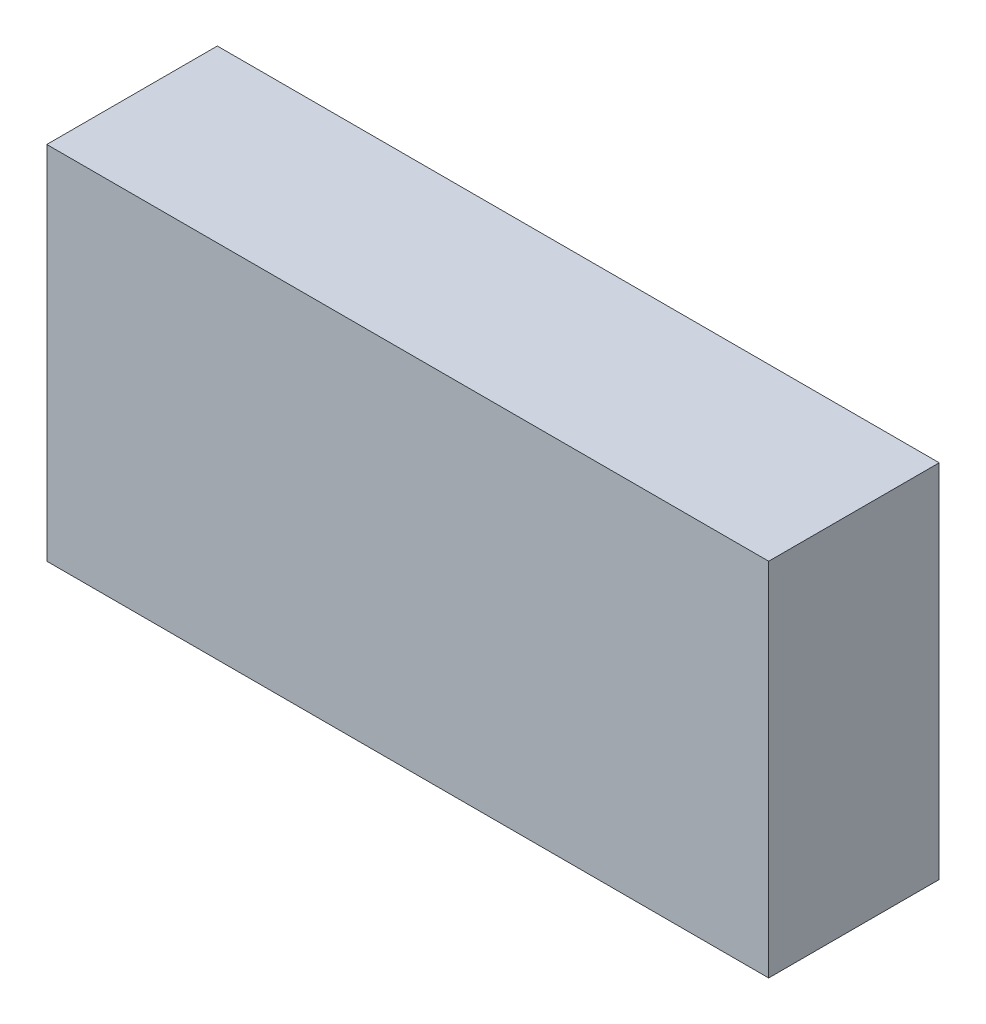
ISO-10303-21;
HEADER;
FILE_DESCRIPTION(('STEP AP214'),'2;1');
FILE_NAME('part.step','',(''),(''),'','','');
FILE_SCHEMA(('AUTOMOTIVE_DESIGN { 1 0 10303 214 1 1 1 1 }'));
ENDSEC;
DATA;
#1=APPLICATION_CONTEXT('core data for automotive mechanical design processes');
#2=APPLICATION_PROTOCOL_DEFINITION('international standard','automotive_design',2000,#1);
#3=PRODUCT_CONTEXT('',#1,'mechanical');
#4=PRODUCT('Part','Part','',(#3));
#5=PRODUCT_RELATED_PRODUCT_CATEGORY('part','',(#4));
#6=PRODUCT_DEFINITION_FORMATION('','',#4);
#7=PRODUCT_DEFINITION_CONTEXT('part definition',#1,'design');
#8=PRODUCT_DEFINITION('design','',#6,#7);
#9=PRODUCT_DEFINITION_SHAPE('','',#8);
#10=(LENGTH_UNIT() NAMED_UNIT(*) SI_UNIT(.MILLI.,.METRE.));
#11=(NAMED_UNIT(*) PLANE_ANGLE_UNIT() SI_UNIT($,.RADIAN.));
#12=(NAMED_UNIT(*) SI_UNIT($,.STERADIAN.) SOLID_ANGLE_UNIT());
#13=UNCERTAINTY_MEASURE_WITH_UNIT(LENGTH_MEASURE(1.E-05),#10,'distance_accuracy_value','');
#14=(GEOMETRIC_REPRESENTATION_CONTEXT(3) GLOBAL_UNCERTAINTY_ASSIGNED_CONTEXT((#13)) GLOBAL_UNIT_ASSIGNED_CONTEXT((#10,
#11,#12)) REPRESENTATION_CONTEXT('',''));
#15=CARTESIAN_POINT('',(0.,0.,0.));
#16=DIRECTION('',(0.,0.,1.));
#17=DIRECTION('',(1.,0.,0.));
#18=AXIS2_PLACEMENT_3D('',#15,#16,#17);
#19=CARTESIAN_POINT('',(0.,0.,6.));
#20=DIRECTION('',(1.,0.,0.));
#21=DIRECTION('',(0.,0.,-1.));
#22=AXIS2_PLACEMENT_3D('',#19,#20,#21);
#23=PLANE('',#22);
#24=DIRECTION('',(0.,-1.,0.));
#25=VECTOR('',#24,1.);
#26=CARTESIAN_POINT('',(0.,0.,0.));
#27=LINE('',#26,#25);
#28=CARTESIAN_POINT('',(0.,12.7,0.));
#29=VERTEX_POINT('',#28);
#30=CARTESIAN_POINT('',(0.,0.,0.));
#31=VERTEX_POINT('',#30);
#32=EDGE_CURVE('E96',#29,#31,#27,.T.);
#33=ORIENTED_EDGE('',*,*,#32,.T.);
#34=DIRECTION('',(0.,0.,-1.));
#35=VECTOR('',#34,1.);
#36=CARTESIAN_POINT('',(0.,0.,6.));
#37=LINE('',#36,#35);
#38=CARTESIAN_POINT('',(0.,0.,6.));
#39=VERTEX_POINT('',#38);
#40=EDGE_CURVE('E11',#39,#31,#37,.T.);
#41=ORIENTED_EDGE('',*,*,#40,.F.);
#42=DIRECTION('',(0.,-1.,0.));
#43=VECTOR('',#42,1.);
#44=CARTESIAN_POINT('',(0.,0.,6.));
#45=LINE('',#44,#43);
#46=CARTESIAN_POINT('',(0.,12.7,6.));
#47=VERTEX_POINT('',#46);
#48=EDGE_CURVE('E84',#47,#39,#45,.T.);
#49=ORIENTED_EDGE('',*,*,#48,.F.);
#50=DIRECTION('',(0.,0.,-1.));
#51=VECTOR('',#50,1.);
#52=CARTESIAN_POINT('',(0.,12.7,6.));
#53=LINE('',#52,#51);
#54=EDGE_CURVE('E92',#47,#29,#53,.T.);
#55=ORIENTED_EDGE('',*,*,#54,.T.);
#56=EDGE_LOOP('',(#33,#41,#49,#55));
#57=FACE_BOUND('',#56,.T.);
#58=ADVANCED_FACE('F33',(#57),#23,.F.);
#59=CARTESIAN_POINT('',(0.,0.,6.));
#60=DIRECTION('',(0.,1.,0.));
#61=DIRECTION('',(0.,0.,1.));
#62=AXIS2_PLACEMENT_3D('',#59,#60,#61);
#63=PLANE('',#62);
#64=DIRECTION('',(1.,0.,0.));
#65=VECTOR('',#64,1.);
#66=CARTESIAN_POINT('',(0.,0.,0.));
#67=LINE('',#66,#65);
#68=CARTESIAN_POINT('',(25.4,0.,0.));
#69=VERTEX_POINT('',#68);
#70=EDGE_CURVE('E88',#31,#69,#67,.T.);
#71=ORIENTED_EDGE('',*,*,#70,.T.);
#72=DIRECTION('',(0.,0.,-1.));
#73=VECTOR('',#72,1.);
#74=CARTESIAN_POINT('',(25.4,0.,6.));
#75=LINE('',#74,#73);
#76=CARTESIAN_POINT('',(25.4,0.,6.));
#77=VERTEX_POINT('',#76);
#78=EDGE_CURVE('E41',#77,#69,#75,.T.);
#79=ORIENTED_EDGE('',*,*,#78,.F.);
#80=DIRECTION('',(1.,0.,0.));
#81=VECTOR('',#80,1.);
#82=CARTESIAN_POINT('',(0.,0.,6.));
#83=LINE('',#82,#81);
#84=EDGE_CURVE('E79',#39,#77,#83,.T.);
#85=ORIENTED_EDGE('',*,*,#84,.F.);
#86=ORIENTED_EDGE('',*,*,#40,.T.);
#87=EDGE_LOOP('',(#71,#79,#85,#86));
#88=FACE_BOUND('',#87,.T.);
#89=ADVANCED_FACE('F87',(#88),#63,.F.);
#90=CARTESIAN_POINT('',(25.4,0.,6.));
#91=DIRECTION('',(-1.,0.,0.));
#92=DIRECTION('',(0.,0.,1.));
#93=AXIS2_PLACEMENT_3D('',#90,#91,#92);
#94=PLANE('',#93);
#95=DIRECTION('',(0.,1.,0.));
#96=VECTOR('',#95,1.);
#97=CARTESIAN_POINT('',(25.4,0.,0.));
#98=LINE('',#97,#96);
#99=CARTESIAN_POINT('',(25.4,12.7,0.));
#100=VERTEX_POINT('',#99);
#101=EDGE_CURVE('E66',#69,#100,#98,.T.);
#102=ORIENTED_EDGE('',*,*,#101,.T.);
#103=DIRECTION('',(0.,0.,-1.));
#104=VECTOR('',#103,1.);
#105=CARTESIAN_POINT('',(25.4,12.7,6.));
#106=LINE('',#105,#104);
#107=CARTESIAN_POINT('',(25.4,12.7,6.));
#108=VERTEX_POINT('',#107);
#109=EDGE_CURVE('E89',#108,#100,#106,.T.);
#110=ORIENTED_EDGE('',*,*,#109,.F.);
#111=DIRECTION('',(0.,1.,0.));
#112=VECTOR('',#111,1.);
#113=CARTESIAN_POINT('',(25.4,0.,6.));
#114=LINE('',#113,#112);
#115=EDGE_CURVE('E82',#77,#108,#114,.T.);
#116=ORIENTED_EDGE('',*,*,#115,.F.);
#117=ORIENTED_EDGE('',*,*,#78,.T.);
#118=EDGE_LOOP('',(#102,#110,#116,#117));
#119=FACE_BOUND('',#118,.T.);
#120=ADVANCED_FACE('F90',(#119),#94,.F.);
#121=CARTESIAN_POINT('',(0.,12.7,6.));
#122=DIRECTION('',(0.,-1.,0.));
#123=DIRECTION('',(0.,0.,-1.));
#124=AXIS2_PLACEMENT_3D('',#121,#122,#123);
#125=PLANE('',#124);
#126=DIRECTION('',(-1.,0.,0.));
#127=VECTOR('',#126,1.);
#128=CARTESIAN_POINT('',(0.,12.7,0.));
#129=LINE('',#128,#127);
#130=EDGE_CURVE('E72',#100,#29,#129,.T.);
#131=ORIENTED_EDGE('',*,*,#130,.T.);
#132=ORIENTED_EDGE('',*,*,#54,.F.);
#133=DIRECTION('',(-1.,0.,0.));
#134=VECTOR('',#133,1.);
#135=CARTESIAN_POINT('',(0.,12.7,6.));
#136=LINE('',#135,#134);
#137=EDGE_CURVE('E49',#108,#47,#136,.T.);
#138=ORIENTED_EDGE('',*,*,#137,.F.);
#139=ORIENTED_EDGE('',*,*,#109,.T.);
#140=EDGE_LOOP('',(#131,#132,#138,#139));
#141=FACE_BOUND('',#140,.T.);
#142=ADVANCED_FACE('F103',(#141),#125,.F.);
#143=CARTESIAN_POINT('',(0.,0.,6.));
#144=DIRECTION('',(0.,0.,-1.));
#145=DIRECTION('',(-1.,0.,0.));
#146=AXIS2_PLACEMENT_3D('',#143,#144,#145);
#147=PLANE('',#146);
#148=ORIENTED_EDGE('',*,*,#48,.T.);
#149=ORIENTED_EDGE('',*,*,#84,.T.);
#150=ORIENTED_EDGE('',*,*,#115,.T.);
#151=ORIENTED_EDGE('',*,*,#137,.T.);
#152=EDGE_LOOP('',(#148,#149,#150,#151));
#153=FACE_BOUND('',#152,.T.);
#154=ADVANCED_FACE('F80',(#153),#147,.F.);
#155=CARTESIAN_POINT('',(0.,0.,0.));
#156=DIRECTION('',(0.,0.,-1.));
#157=DIRECTION('',(-1.,0.,0.));
#158=AXIS2_PLACEMENT_3D('',#155,#156,#157);
#159=PLANE('',#158);
#160=ORIENTED_EDGE('',*,*,#32,.F.);
#161=ORIENTED_EDGE('',*,*,#130,.F.);
#162=ORIENTED_EDGE('',*,*,#101,.F.);
#163=ORIENTED_EDGE('',*,*,#70,.F.);
#164=EDGE_LOOP('',(#160,#161,#162,#163));
#165=FACE_BOUND('',#164,.T.);
#166=ADVANCED_FACE('F106',(#165),#159,.T.);
#167=CLOSED_SHELL('',(#58,#89,#120,#142,#154,#166));
#168=MANIFOLD_SOLID_BREP('B2',#167);
#169=ADVANCED_BREP_SHAPE_REPRESENTATION('',(#18,#168),#14);
#170=SHAPE_DEFINITION_REPRESENTATION(#9,#169);
ENDSEC;
END-ISO-10303-21;
